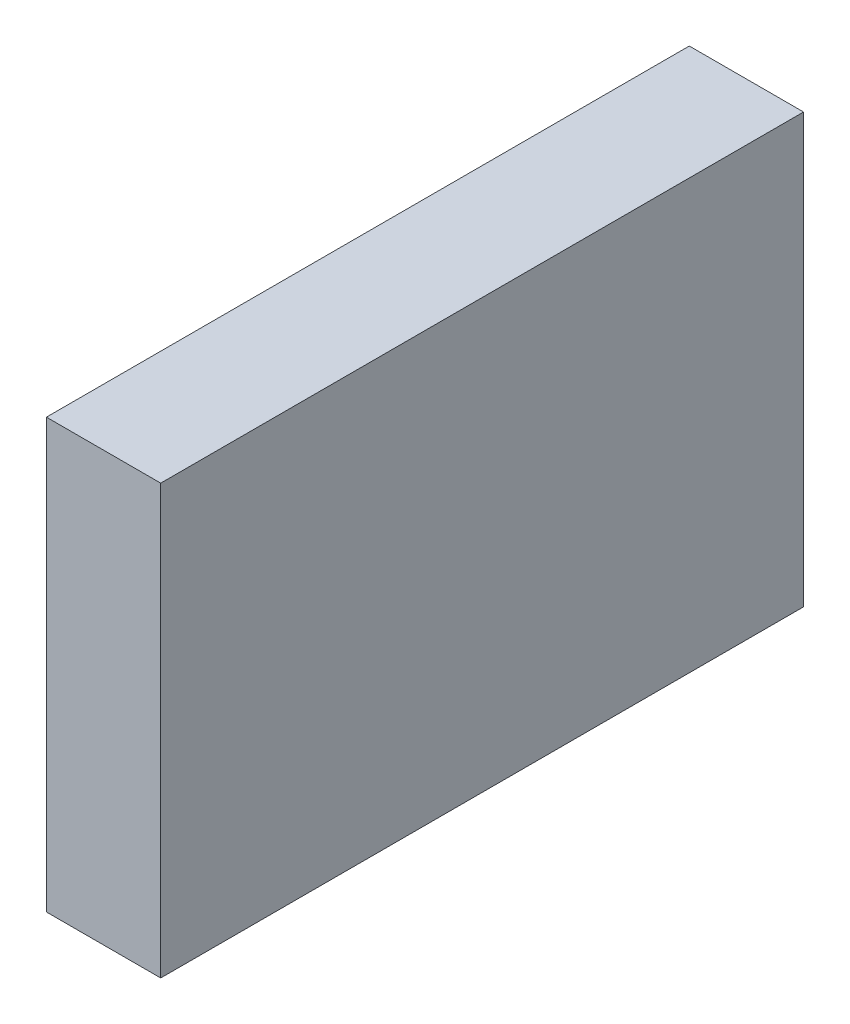
ISO-10303-21;
HEADER;
FILE_DESCRIPTION(('STEP AP214'),'2;1');
FILE_NAME('part.step','',(''),(''),'','','');
FILE_SCHEMA(('AUTOMOTIVE_DESIGN { 1 0 10303 214 1 1 1 1 }'));
ENDSEC;
DATA;
#1=APPLICATION_CONTEXT('core data for automotive mechanical design processes');
#2=APPLICATION_PROTOCOL_DEFINITION('international standard','automotive_design',2000,#1);
#3=PRODUCT_CONTEXT('',#1,'mechanical');
#4=PRODUCT('Part','Part','',(#3));
#5=PRODUCT_RELATED_PRODUCT_CATEGORY('part','',(#4));
#6=PRODUCT_DEFINITION_FORMATION('','',#4);
#7=PRODUCT_DEFINITION_CONTEXT('part definition',#1,'design');
#8=PRODUCT_DEFINITION('design','',#6,#7);
#9=PRODUCT_DEFINITION_SHAPE('','',#8);
#10=(LENGTH_UNIT() NAMED_UNIT(*) SI_UNIT(.MILLI.,.METRE.));
#11=(NAMED_UNIT(*) PLANE_ANGLE_UNIT() SI_UNIT($,.RADIAN.));
#12=(NAMED_UNIT(*) SI_UNIT($,.STERADIAN.) SOLID_ANGLE_UNIT());
#13=UNCERTAINTY_MEASURE_WITH_UNIT(LENGTH_MEASURE(1.E-05),#10,'distance_accuracy_value','');
#14=(GEOMETRIC_REPRESENTATION_CONTEXT(3) GLOBAL_UNCERTAINTY_ASSIGNED_CONTEXT((#13)) GLOBAL_UNIT_ASSIGNED_CONTEXT((#10,
#11,#12)) REPRESENTATION_CONTEXT('',''));
#15=CARTESIAN_POINT('',(0.,0.,0.));
#16=DIRECTION('',(0.,0.,1.));
#17=DIRECTION('',(1.,0.,0.));
#18=AXIS2_PLACEMENT_3D('',#15,#16,#17);
#19=CARTESIAN_POINT('',(-4.,15.,45.));
#20=DIRECTION('',(1.,0.,0.));
#21=DIRECTION('',(0.,0.,-1.));
#22=AXIS2_PLACEMENT_3D('',#19,#20,#21);
#23=PLANE('',#22);
#24=DIRECTION('',(0.,-1.,0.));
#25=VECTOR('',#24,1.);
#26=CARTESIAN_POINT('',(-4.,15.,0.));
#27=LINE('',#26,#25);
#28=CARTESIAN_POINT('',(-4.,15.,0.));
#29=VERTEX_POINT('',#28);
#30=CARTESIAN_POINT('',(-4.,-15.,0.));
#31=VERTEX_POINT('',#30);
#32=EDGE_CURVE('E100',#29,#31,#27,.T.);
#33=ORIENTED_EDGE('',*,*,#32,.T.);
#34=DIRECTION('',(0.,0.,-1.));
#35=VECTOR('',#34,1.);
#36=CARTESIAN_POINT('',(-4.,-15.,45.));
#37=LINE('',#36,#35);
#38=CARTESIAN_POINT('',(-4.,-15.,45.));
#39=VERTEX_POINT('',#38);
#40=EDGE_CURVE('E11',#39,#31,#37,.T.);
#41=ORIENTED_EDGE('',*,*,#40,.F.);
#42=DIRECTION('',(0.,-1.,0.));
#43=VECTOR('',#42,1.);
#44=CARTESIAN_POINT('',(-4.,15.,45.));
#45=LINE('',#44,#43);
#46=CARTESIAN_POINT('',(-4.,15.,45.));
#47=VERTEX_POINT('',#46);
#48=EDGE_CURVE('E88',#47,#39,#45,.T.);
#49=ORIENTED_EDGE('',*,*,#48,.F.);
#50=DIRECTION('',(0.,0.,-1.));
#51=VECTOR('',#50,1.);
#52=CARTESIAN_POINT('',(-4.,15.,45.));
#53=LINE('',#52,#51);
#54=EDGE_CURVE('E96',#47,#29,#53,.T.);
#55=ORIENTED_EDGE('',*,*,#54,.T.);
#56=EDGE_LOOP('',(#33,#41,#49,#55));
#57=FACE_BOUND('',#56,.T.);
#58=ADVANCED_FACE('F37',(#57),#23,.F.);
#59=CARTESIAN_POINT('',(-4.,-15.,45.));
#60=DIRECTION('',(0.,1.,0.));
#61=DIRECTION('',(0.,0.,1.));
#62=AXIS2_PLACEMENT_3D('',#59,#60,#61);
#63=PLANE('',#62);
#64=DIRECTION('',(1.,0.,0.));
#65=VECTOR('',#64,1.);
#66=CARTESIAN_POINT('',(-4.,-15.,0.));
#67=LINE('',#66,#65);
#68=CARTESIAN_POINT('',(4.,-15.,0.));
#69=VERTEX_POINT('',#68);
#70=EDGE_CURVE('E92',#31,#69,#67,.T.);
#71=ORIENTED_EDGE('',*,*,#70,.T.);
#72=DIRECTION('',(0.,0.,-1.));
#73=VECTOR('',#72,1.);
#74=CARTESIAN_POINT('',(4.,-15.,45.));
#75=LINE('',#74,#73);
#76=CARTESIAN_POINT('',(4.,-15.,45.));
#77=VERTEX_POINT('',#76);
#78=EDGE_CURVE('E45',#77,#69,#75,.T.);
#79=ORIENTED_EDGE('',*,*,#78,.F.);
#80=DIRECTION('',(1.,0.,0.));
#81=VECTOR('',#80,1.);
#82=CARTESIAN_POINT('',(-4.,-15.,45.));
#83=LINE('',#82,#81);
#84=EDGE_CURVE('E83',#39,#77,#83,.T.);
#85=ORIENTED_EDGE('',*,*,#84,.F.);
#86=ORIENTED_EDGE('',*,*,#40,.T.);
#87=EDGE_LOOP('',(#71,#79,#85,#86));
#88=FACE_BOUND('',#87,.T.);
#89=ADVANCED_FACE('F91',(#88),#63,.F.);
#90=CARTESIAN_POINT('',(4.,-15.,45.));
#91=DIRECTION('',(-1.,0.,0.));
#92=DIRECTION('',(0.,0.,1.));
#93=AXIS2_PLACEMENT_3D('',#90,#91,#92);
#94=PLANE('',#93);
#95=DIRECTION('',(0.,1.,0.));
#96=VECTOR('',#95,1.);
#97=CARTESIAN_POINT('',(4.,-15.,0.));
#98=LINE('',#97,#96);
#99=CARTESIAN_POINT('',(4.,15.,0.));
#100=VERTEX_POINT('',#99);
#101=EDGE_CURVE('E70',#69,#100,#98,.T.);
#102=ORIENTED_EDGE('',*,*,#101,.T.);
#103=DIRECTION('',(0.,0.,-1.));
#104=VECTOR('',#103,1.);
#105=CARTESIAN_POINT('',(4.,15.,45.));
#106=LINE('',#105,#104);
#107=CARTESIAN_POINT('',(4.,15.,45.));
#108=VERTEX_POINT('',#107);
#109=EDGE_CURVE('E93',#108,#100,#106,.T.);
#110=ORIENTED_EDGE('',*,*,#109,.F.);
#111=DIRECTION('',(0.,1.,0.));
#112=VECTOR('',#111,1.);
#113=CARTESIAN_POINT('',(4.,-15.,45.));
#114=LINE('',#113,#112);
#115=EDGE_CURVE('E86',#77,#108,#114,.T.);
#116=ORIENTED_EDGE('',*,*,#115,.F.);
#117=ORIENTED_EDGE('',*,*,#78,.T.);
#118=EDGE_LOOP('',(#102,#110,#116,#117));
#119=FACE_BOUND('',#118,.T.);
#120=ADVANCED_FACE('F94',(#119),#94,.F.);
#121=CARTESIAN_POINT('',(4.,15.,45.));
#122=DIRECTION('',(0.,-1.,0.));
#123=DIRECTION('',(0.,0.,-1.));
#124=AXIS2_PLACEMENT_3D('',#121,#122,#123);
#125=PLANE('',#124);
#126=DIRECTION('',(-1.,0.,0.));
#127=VECTOR('',#126,1.);
#128=CARTESIAN_POINT('',(4.,15.,0.));
#129=LINE('',#128,#127);
#130=EDGE_CURVE('E76',#100,#29,#129,.T.);
#131=ORIENTED_EDGE('',*,*,#130,.T.);
#132=ORIENTED_EDGE('',*,*,#54,.F.);
#133=DIRECTION('',(-1.,0.,0.));
#134=VECTOR('',#133,1.);
#135=CARTESIAN_POINT('',(4.,15.,45.));
#136=LINE('',#135,#134);
#137=EDGE_CURVE('E53',#108,#47,#136,.T.);
#138=ORIENTED_EDGE('',*,*,#137,.F.);
#139=ORIENTED_EDGE('',*,*,#109,.T.);
#140=EDGE_LOOP('',(#131,#132,#138,#139));
#141=FACE_BOUND('',#140,.T.);
#142=ADVANCED_FACE('F107',(#141),#125,.F.);
#143=CARTESIAN_POINT('',(0.,0.,45.));
#144=DIRECTION('',(0.,0.,1.));
#145=DIRECTION('',(1.,0.,0.));
#146=AXIS2_PLACEMENT_3D('',#143,#144,#145);
#147=PLANE('',#146);
#148=ORIENTED_EDGE('',*,*,#48,.T.);
#149=ORIENTED_EDGE('',*,*,#84,.T.);
#150=ORIENTED_EDGE('',*,*,#115,.T.);
#151=ORIENTED_EDGE('',*,*,#137,.T.);
#152=EDGE_LOOP('',(#148,#149,#150,#151));
#153=FACE_BOUND('',#152,.T.);
#154=ADVANCED_FACE('F84',(#153),#147,.T.);
#155=CARTESIAN_POINT('',(0.,0.,0.));
#156=DIRECTION('',(0.,0.,1.));
#157=DIRECTION('',(1.,0.,0.));
#158=AXIS2_PLACEMENT_3D('',#155,#156,#157);
#159=PLANE('',#158);
#160=ORIENTED_EDGE('',*,*,#32,.F.);
#161=ORIENTED_EDGE('',*,*,#130,.F.);
#162=ORIENTED_EDGE('',*,*,#101,.F.);
#163=ORIENTED_EDGE('',*,*,#70,.F.);
#164=EDGE_LOOP('',(#160,#161,#162,#163));
#165=FACE_BOUND('',#164,.T.);
#166=ADVANCED_FACE('F110',(#165),#159,.F.);
#167=CLOSED_SHELL('',(#58,#89,#120,#142,#154,#166));
#168=MANIFOLD_SOLID_BREP('B2',#167);
#169=ADVANCED_BREP_SHAPE_REPRESENTATION('',(#18,#168),#14);
#170=SHAPE_DEFINITION_REPRESENTATION(#9,#169);
ENDSEC;
END-ISO-10303-21;
